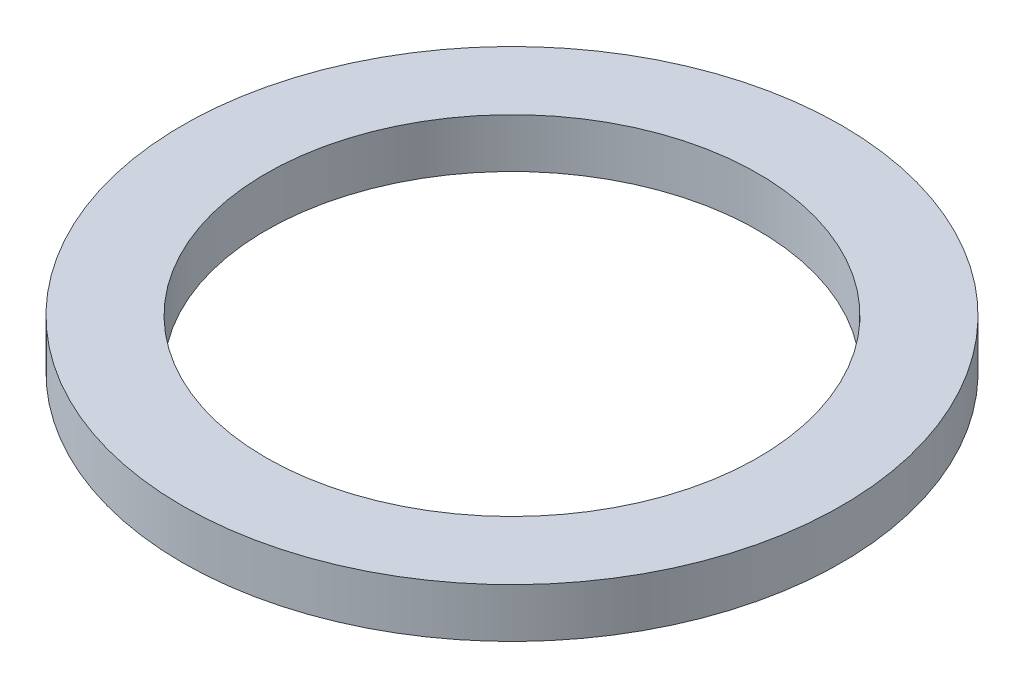
ISO-10303-21;
HEADER;
FILE_DESCRIPTION(('STEP AP214'),'2;1');
FILE_NAME('part.step','',(''),(''),'','','');
FILE_SCHEMA(('AUTOMOTIVE_DESIGN { 1 0 10303 214 1 1 1 1 }'));
ENDSEC;
DATA;
#1=APPLICATION_CONTEXT('core data for automotive mechanical design processes');
#2=APPLICATION_PROTOCOL_DEFINITION('international standard','automotive_design',2000,#1);
#3=PRODUCT_CONTEXT('',#1,'mechanical');
#4=PRODUCT('Part','Part','',(#3));
#5=PRODUCT_RELATED_PRODUCT_CATEGORY('part','',(#4));
#6=PRODUCT_DEFINITION_FORMATION('','',#4);
#7=PRODUCT_DEFINITION_CONTEXT('part definition',#1,'design');
#8=PRODUCT_DEFINITION('design','',#6,#7);
#9=PRODUCT_DEFINITION_SHAPE('','',#8);
#10=(LENGTH_UNIT() NAMED_UNIT(*) SI_UNIT(.MILLI.,.METRE.));
#11=(NAMED_UNIT(*) PLANE_ANGLE_UNIT() SI_UNIT($,.RADIAN.));
#12=(NAMED_UNIT(*) SI_UNIT($,.STERADIAN.) SOLID_ANGLE_UNIT());
#13=UNCERTAINTY_MEASURE_WITH_UNIT(LENGTH_MEASURE(1.E-05),#10,'distance_accuracy_value','');
#14=(GEOMETRIC_REPRESENTATION_CONTEXT(3) GLOBAL_UNCERTAINTY_ASSIGNED_CONTEXT((#13)) GLOBAL_UNIT_ASSIGNED_CONTEXT((#10,
#11,#12)) REPRESENTATION_CONTEXT('',''));
#15=CARTESIAN_POINT('',(0.,0.,0.));
#16=DIRECTION('',(0.,0.,1.));
#17=DIRECTION('',(1.,0.,0.));
#18=AXIS2_PLACEMENT_3D('',#15,#16,#17);
#19=CARTESIAN_POINT('',(0.,0.7112,0.));
#20=DIRECTION('',(0.,-1.,0.));
#21=DIRECTION('',(0.,0.,-1.));
#22=AXIS2_PLACEMENT_3D('',#19,#20,#21);
#23=CYLINDRICAL_SURFACE('',#22,4.7625);
#24=CARTESIAN_POINT('',(0.,0.7112,0.));
#25=DIRECTION('',(0.,1.,0.));
#26=DIRECTION('',(0.,0.,1.));
#27=AXIS2_PLACEMENT_3D('',#24,#25,#26);
#28=CIRCLE('',#27,4.7625);
#29=CARTESIAN_POINT('',(0.,0.7112,4.7625));
#30=VERTEX_POINT('',#29);
#31=EDGE_CURVE('E10',#30,#30,#28,.T.);
#32=ORIENTED_EDGE('',*,*,#31,.F.);
#33=EDGE_LOOP('',(#32));
#34=FACE_BOUND('',#33,.T.);
#35=CARTESIAN_POINT('',(0.,0.,0.));
#36=DIRECTION('',(0.,1.,0.));
#37=DIRECTION('',(0.,0.,1.));
#38=AXIS2_PLACEMENT_3D('',#35,#36,#37);
#39=CIRCLE('',#38,4.7625);
#40=CARTESIAN_POINT('',(0.,0.,4.7625));
#41=VERTEX_POINT('',#40);
#42=EDGE_CURVE('E35',#41,#41,#39,.T.);
#43=ORIENTED_EDGE('',*,*,#42,.T.);
#44=EDGE_LOOP('',(#43));
#45=FACE_BOUND('',#44,.T.);
#46=ADVANCED_FACE('F32',(#34,#45),#23,.T.);
#47=CARTESIAN_POINT('',(0.,0.7112,0.));
#48=DIRECTION('',(0.,1.,0.));
#49=DIRECTION('',(0.,0.,1.));
#50=AXIS2_PLACEMENT_3D('',#47,#48,#49);
#51=PLANE('',#50);
#52=CARTESIAN_POINT('',(0.,0.7112,0.));
#53=DIRECTION('',(0.,1.,0.));
#54=DIRECTION('',(0.,0.,1.));
#55=AXIS2_PLACEMENT_3D('',#52,#53,#54);
#56=CIRCLE('',#55,3.556);
#57=CARTESIAN_POINT('',(0.,0.7112,3.556));
#58=VERTEX_POINT('',#57);
#59=EDGE_CURVE('E44',#58,#58,#56,.T.);
#60=ORIENTED_EDGE('',*,*,#59,.F.);
#61=EDGE_LOOP('',(#60));
#62=FACE_BOUND('',#61,.T.);
#63=ORIENTED_EDGE('',*,*,#31,.T.);
#64=EDGE_LOOP('',(#63));
#65=FACE_BOUND('',#64,.T.);
#66=ADVANCED_FACE('F59',(#62,#65),#51,.T.);
#67=CARTESIAN_POINT('',(0.,0.,0.));
#68=DIRECTION('',(0.,1.,0.));
#69=DIRECTION('',(0.,0.,1.));
#70=AXIS2_PLACEMENT_3D('',#67,#68,#69);
#71=PLANE('',#70);
#72=CARTESIAN_POINT('',(0.,0.,0.));
#73=DIRECTION('',(0.,1.,0.));
#74=DIRECTION('',(0.,0.,1.));
#75=AXIS2_PLACEMENT_3D('',#72,#73,#74);
#76=CIRCLE('',#75,3.556);
#77=CARTESIAN_POINT('',(0.,0.,3.556));
#78=VERTEX_POINT('',#77);
#79=EDGE_CURVE('E42',#78,#78,#76,.T.);
#80=ORIENTED_EDGE('',*,*,#79,.T.);
#81=EDGE_LOOP('',(#80));
#82=FACE_BOUND('',#81,.T.);
#83=ORIENTED_EDGE('',*,*,#42,.F.);
#84=EDGE_LOOP('',(#83));
#85=FACE_BOUND('',#84,.T.);
#86=ADVANCED_FACE('F50',(#82,#85),#71,.F.);
#87=CARTESIAN_POINT('',(0.,0.,0.));
#88=DIRECTION('',(0.,1.,0.));
#89=DIRECTION('',(0.,0.,1.));
#90=AXIS2_PLACEMENT_3D('',#87,#88,#89);
#91=CYLINDRICAL_SURFACE('',#90,3.556);
#92=ORIENTED_EDGE('',*,*,#79,.F.);
#93=EDGE_LOOP('',(#92));
#94=FACE_BOUND('',#93,.T.);
#95=ORIENTED_EDGE('',*,*,#59,.T.);
#96=EDGE_LOOP('',(#95));
#97=FACE_BOUND('',#96,.T.);
#98=ADVANCED_FACE('F53',(#94,#97),#91,.F.);
#99=CLOSED_SHELL('',(#46,#66,#86,#98));
#100=MANIFOLD_SOLID_BREP('B2',#99);
#101=ADVANCED_BREP_SHAPE_REPRESENTATION('',(#18,#100),#14);
#102=SHAPE_DEFINITION_REPRESENTATION(#9,#101);
ENDSEC;
END-ISO-10303-21;
